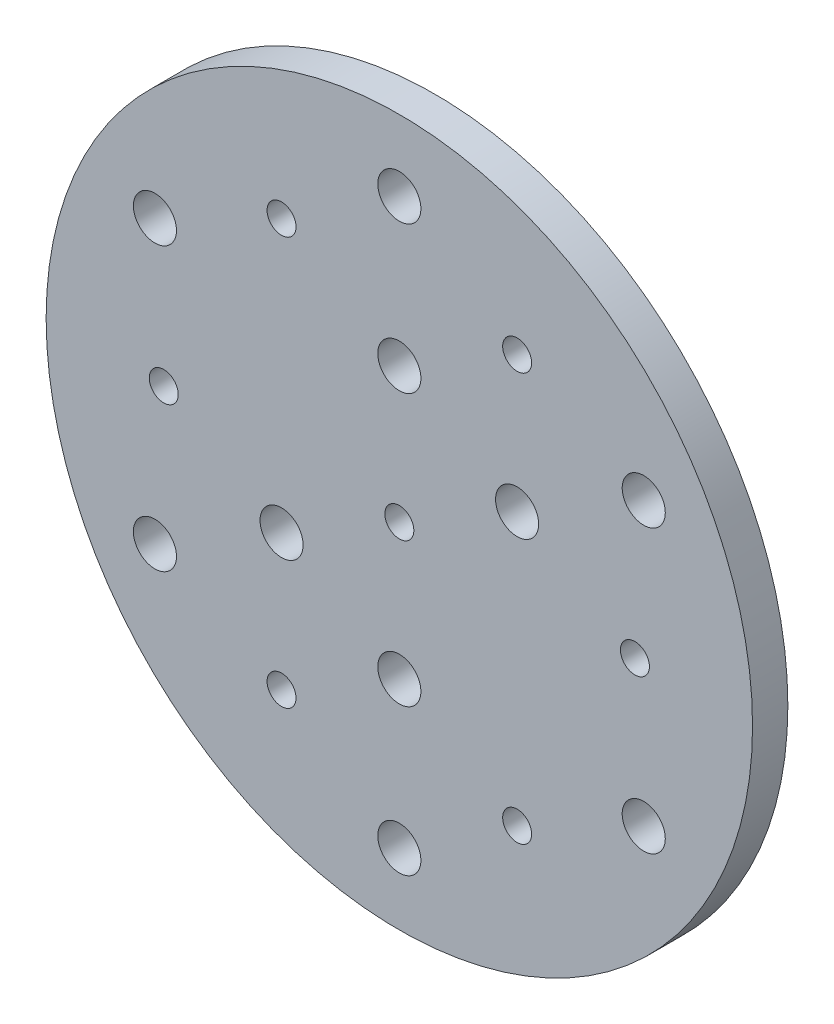
ISO-10303-21;
HEADER;
FILE_DESCRIPTION(('STEP AP214'),'2;1');
FILE_NAME('part.step','',(''),(''),'','','');
FILE_SCHEMA(('AUTOMOTIVE_DESIGN { 1 0 10303 214 1 1 1 1 }'));
ENDSEC;
DATA;
#1=APPLICATION_CONTEXT('core data for automotive mechanical design processes');
#2=APPLICATION_PROTOCOL_DEFINITION('international standard','automotive_design',2000,#1);
#3=PRODUCT_CONTEXT('',#1,'mechanical');
#4=PRODUCT('Part','Part','',(#3));
#5=PRODUCT_RELATED_PRODUCT_CATEGORY('part','',(#4));
#6=PRODUCT_DEFINITION_FORMATION('','',#4);
#7=PRODUCT_DEFINITION_CONTEXT('part definition',#1,'design');
#8=PRODUCT_DEFINITION('design','',#6,#7);
#9=PRODUCT_DEFINITION_SHAPE('','',#8);
#10=(LENGTH_UNIT() NAMED_UNIT(*) SI_UNIT(.MILLI.,.METRE.));
#11=(NAMED_UNIT(*) PLANE_ANGLE_UNIT() SI_UNIT($,.RADIAN.));
#12=(NAMED_UNIT(*) SI_UNIT($,.STERADIAN.) SOLID_ANGLE_UNIT());
#13=UNCERTAINTY_MEASURE_WITH_UNIT(LENGTH_MEASURE(1.E-05),#10,'distance_accuracy_value','');
#14=(GEOMETRIC_REPRESENTATION_CONTEXT(3) GLOBAL_UNCERTAINTY_ASSIGNED_CONTEXT((#13)) GLOBAL_UNIT_ASSIGNED_CONTEXT((#10,
#11,#12)) REPRESENTATION_CONTEXT('',''));
#15=CARTESIAN_POINT('',(0.,0.,0.));
#16=DIRECTION('',(0.,0.,1.));
#17=DIRECTION('',(1.,0.,0.));
#18=AXIS2_PLACEMENT_3D('',#15,#16,#17);
#19=CARTESIAN_POINT('',(0.,0.,5.));
#20=DIRECTION('',(0.,0.,1.));
#21=DIRECTION('',(1.,0.,0.));
#22=AXIS2_PLACEMENT_3D('',#19,#20,#21);
#23=PLANE('',#22);
#24=CARTESIAN_POINT('',(-16.671397032512,-9.62523556448782,5.));
#25=DIRECTION('',(0.,0.,1.));
#26=DIRECTION('',(1.,0.,0.));
#27=AXIS2_PLACEMENT_3D('',#24,#25,#26);
#28=CIRCLE('',#27,3.05);
#29=CARTESIAN_POINT('',(-13.621397032512,-9.62523556448782,5.));
#30=VERTEX_POINT('',#29);
#31=EDGE_CURVE('E131',#30,#30,#28,.T.);
#32=ORIENTED_EDGE('',*,*,#31,.F.);
#33=EDGE_LOOP('',(#32));
#34=FACE_BOUND('',#33,.T.);
#35=CARTESIAN_POINT('',(16.6749999999995,-28.8819472162113,5.));
#36=DIRECTION('',(0.,0.,1.));
#37=DIRECTION('',(1.,0.,0.));
#38=AXIS2_PLACEMENT_3D('',#35,#36,#37);
#39=CIRCLE('',#38,2.04999999999999);
#40=CARTESIAN_POINT('',(18.7249999999995,-28.8819472162113,5.));
#41=VERTEX_POINT('',#40);
#42=EDGE_CURVE('E119',#41,#41,#39,.T.);
#43=ORIENTED_EDGE('',*,*,#42,.F.);
#44=EDGE_LOOP('',(#43));
#45=FACE_BOUND('',#44,.T.);
#46=CARTESIAN_POINT('',(16.6750000000003,28.8819472162108,5.));
#47=DIRECTION('',(0.,0.,1.));
#48=DIRECTION('',(1.,0.,0.));
#49=AXIS2_PLACEMENT_3D('',#46,#47,#48);
#50=CIRCLE('',#49,2.04999999999999);
#51=CARTESIAN_POINT('',(18.7250000000003,28.8819472162108,5.));
#52=VERTEX_POINT('',#51);
#53=EDGE_CURVE('E107',#52,#52,#50,.T.);
#54=ORIENTED_EDGE('',*,*,#53,.F.);
#55=EDGE_LOOP('',(#54));
#56=FACE_BOUND('',#55,.T.);
#57=CARTESIAN_POINT('',(-33.35,2.35370913809432E-13,5.));
#58=DIRECTION('',(0.,0.,1.));
#59=DIRECTION('',(1.,0.,0.));
#60=AXIS2_PLACEMENT_3D('',#57,#58,#59);
#61=CIRCLE('',#60,2.04999999999999);
#62=CARTESIAN_POINT('',(-31.3,2.35370913809432E-13,5.));
#63=VERTEX_POINT('',#62);
#64=EDGE_CURVE('E95',#63,#63,#61,.T.);
#65=ORIENTED_EDGE('',*,*,#64,.F.);
#66=EDGE_LOOP('',(#65));
#67=FACE_BOUND('',#66,.T.);
#68=CARTESIAN_POINT('',(0.,-19.2327576355968,5.));
#69=DIRECTION('',(0.,0.,1.));
#70=DIRECTION('',(1.,0.,0.));
#71=AXIS2_PLACEMENT_3D('',#68,#69,#70);
#72=CIRCLE('',#71,3.05);
#73=CARTESIAN_POINT('',(3.05,-19.2327576355968,5.));
#74=VERTEX_POINT('',#73);
#75=EDGE_CURVE('E83',#74,#74,#72,.T.);
#76=ORIENTED_EDGE('',*,*,#75,.F.);
#77=EDGE_LOOP('',(#76));
#78=FACE_BOUND('',#77,.T.);
#79=CARTESIAN_POINT('',(-34.597845014494,-19.9750751325,5.));
#80=DIRECTION('',(0.,0.,1.));
#81=DIRECTION('',(1.,0.,0.));
#82=AXIS2_PLACEMENT_3D('',#79,#80,#81);
#83=CIRCLE('',#82,3.04999999999995);
#84=CARTESIAN_POINT('',(-31.547845014494,-19.9750751325,5.));
#85=VERTEX_POINT('',#84);
#86=EDGE_CURVE('E71',#85,#85,#83,.T.);
#87=ORIENTED_EDGE('',*,*,#86,.F.);
#88=EDGE_LOOP('',(#87));
#89=FACE_BOUND('',#88,.T.);
#90=CARTESIAN_POINT('',(34.5978450144957,19.9750751325029,5.));
#91=DIRECTION('',(0.,0.,1.));
#92=DIRECTION('',(1.,0.,0.));
#93=AXIS2_PLACEMENT_3D('',#90,#91,#92);
#94=CIRCLE('',#93,3.05000000000321);
#95=CARTESIAN_POINT('',(37.6478450144989,19.9750751325029,5.));
#96=VERTEX_POINT('',#95);
#97=EDGE_CURVE('E59',#96,#96,#94,.T.);
#98=ORIENTED_EDGE('',*,*,#97,.F.);
#99=EDGE_LOOP('',(#98));
#100=FACE_BOUND('',#99,.T.);
#101=CARTESIAN_POINT('',(34.5978450144973,-19.9750751324971,5.));
#102=DIRECTION('',(0.,0.,1.));
#103=DIRECTION('',(1.,0.,0.));
#104=AXIS2_PLACEMENT_3D('',#101,#102,#103);
#105=CIRCLE('',#104,3.05000000000264);
#106=CARTESIAN_POINT('',(37.6478450144999,-19.9750751324971,5.));
#107=VERTEX_POINT('',#106);
#108=EDGE_CURVE('E47',#107,#107,#105,.T.);
#109=ORIENTED_EDGE('',*,*,#108,.F.);
#110=EDGE_LOOP('',(#109));
#111=FACE_BOUND('',#110,.T.);
#112=CARTESIAN_POINT('',(0.,0.,5.));
#113=DIRECTION('',(0.,0.,1.));
#114=DIRECTION('',(1.,0.,0.));
#115=AXIS2_PLACEMENT_3D('',#112,#113,#114);
#116=CIRCLE('',#115,50.);
#117=CARTESIAN_POINT('',(50.,0.,5.));
#118=VERTEX_POINT('',#117);
#119=EDGE_CURVE('E10',#118,#118,#116,.T.);
#120=ORIENTED_EDGE('',*,*,#119,.T.);
#121=EDGE_LOOP('',(#120));
#122=FACE_BOUND('',#121,.T.);
#123=CARTESIAN_POINT('',(-34.5978450144956,19.9750751325,5.));
#124=DIRECTION('',(0.,0.,1.));
#125=DIRECTION('',(1.,0.,0.));
#126=AXIS2_PLACEMENT_3D('',#123,#124,#125);
#127=CIRCLE('',#126,3.05);
#128=CARTESIAN_POINT('',(-31.5478450144956,19.9750751325,5.));
#129=VERTEX_POINT('',#128);
#130=EDGE_CURVE('E42',#129,#129,#127,.T.);
#131=ORIENTED_EDGE('',*,*,#130,.F.);
#132=EDGE_LOOP('',(#131));
#133=FACE_BOUND('',#132,.T.);
#134=CARTESIAN_POINT('',(-1.88390969491081E-12,39.9501502650015,5.));
#135=DIRECTION('',(0.,0.,1.));
#136=DIRECTION('',(1.,0.,0.));
#137=AXIS2_PLACEMENT_3D('',#134,#135,#136);
#138=CIRCLE('',#137,3.05000000000294);
#139=CARTESIAN_POINT('',(3.05000000000106,39.9501502650015,5.));
#140=VERTEX_POINT('',#139);
#141=EDGE_CURVE('E53',#140,#140,#138,.T.);
#142=ORIENTED_EDGE('',*,*,#141,.F.);
#143=EDGE_LOOP('',(#142));
#144=FACE_BOUND('',#143,.T.);
#145=CARTESIAN_POINT('',(2.50747571869056E-12,-39.9501502649986,5.));
#146=DIRECTION('',(0.,0.,1.));
#147=DIRECTION('',(1.,0.,0.));
#148=AXIS2_PLACEMENT_3D('',#145,#146,#147);
#149=CIRCLE('',#148,3.05000000000111);
#150=CARTESIAN_POINT('',(3.05000000000361,-39.9501502649986,5.));
#151=VERTEX_POINT('',#150);
#152=EDGE_CURVE('E65',#151,#151,#149,.T.);
#153=ORIENTED_EDGE('',*,*,#152,.F.);
#154=EDGE_LOOP('',(#153));
#155=FACE_BOUND('',#154,.T.);
#156=CARTESIAN_POINT('',(0.,19.165334425404,5.));
#157=DIRECTION('',(0.,0.,1.));
#158=DIRECTION('',(1.,0.,0.));
#159=AXIS2_PLACEMENT_3D('',#156,#157,#158);
#160=CIRCLE('',#159,3.05);
#161=CARTESIAN_POINT('',(3.05,19.165334425404,5.));
#162=VERTEX_POINT('',#161);
#163=EDGE_CURVE('E77',#162,#162,#160,.T.);
#164=ORIENTED_EDGE('',*,*,#163,.F.);
#165=EDGE_LOOP('',(#164));
#166=FACE_BOUND('',#165,.T.);
#167=CARTESIAN_POINT('',(0.,0.,5.));
#168=DIRECTION('',(0.,0.,1.));
#169=DIRECTION('',(1.,0.,0.));
#170=AXIS2_PLACEMENT_3D('',#167,#168,#169);
#171=CIRCLE('',#170,2.05);
#172=CARTESIAN_POINT('',(2.05,0.,5.));
#173=VERTEX_POINT('',#172);
#174=EDGE_CURVE('E89',#173,#173,#171,.T.);
#175=ORIENTED_EDGE('',*,*,#174,.F.);
#176=EDGE_LOOP('',(#175));
#177=FACE_BOUND('',#176,.T.);
#178=CARTESIAN_POINT('',(-16.6749999999997,28.8819472162112,5.));
#179=DIRECTION('',(0.,0.,1.));
#180=DIRECTION('',(1.,0.,0.));
#181=AXIS2_PLACEMENT_3D('',#178,#179,#180);
#182=CIRCLE('',#181,2.04999999999999);
#183=CARTESIAN_POINT('',(-14.6249999999997,28.8819472162112,5.));
#184=VERTEX_POINT('',#183);
#185=EDGE_CURVE('E101',#184,#184,#182,.T.);
#186=ORIENTED_EDGE('',*,*,#185,.F.);
#187=EDGE_LOOP('',(#186));
#188=FACE_BOUND('',#187,.T.);
#189=CARTESIAN_POINT('',(33.35,-4.68252719110269E-13,5.));
#190=DIRECTION('',(0.,0.,1.));
#191=DIRECTION('',(1.,0.,0.));
#192=AXIS2_PLACEMENT_3D('',#189,#190,#191);
#193=CIRCLE('',#192,2.05);
#194=CARTESIAN_POINT('',(35.4,-4.68252719110269E-13,5.));
#195=VERTEX_POINT('',#194);
#196=EDGE_CURVE('E113',#195,#195,#193,.T.);
#197=ORIENTED_EDGE('',*,*,#196,.F.);
#198=EDGE_LOOP('',(#197));
#199=FACE_BOUND('',#198,.T.);
#200=CARTESIAN_POINT('',(-16.6750000000005,-28.8819472162107,5.));
#201=DIRECTION('',(0.,0.,1.));
#202=DIRECTION('',(1.,0.,0.));
#203=AXIS2_PLACEMENT_3D('',#200,#201,#202);
#204=CIRCLE('',#203,2.04999999999999);
#205=CARTESIAN_POINT('',(-14.6250000000005,-28.8819472162107,5.));
#206=VERTEX_POINT('',#205);
#207=EDGE_CURVE('E125',#206,#206,#204,.T.);
#208=ORIENTED_EDGE('',*,*,#207,.F.);
#209=EDGE_LOOP('',(#208));
#210=FACE_BOUND('',#209,.T.);
#211=CARTESIAN_POINT('',(16.6695717959106,9.62418176364465,5.));
#212=DIRECTION('',(0.,0.,1.));
#213=DIRECTION('',(1.,0.,0.));
#214=AXIS2_PLACEMENT_3D('',#211,#212,#213);
#215=CIRCLE('',#214,3.05);
#216=CARTESIAN_POINT('',(19.7195717959106,9.62418176364465,5.));
#217=VERTEX_POINT('',#216);
#218=EDGE_CURVE('E137',#217,#217,#215,.T.);
#219=ORIENTED_EDGE('',*,*,#218,.F.);
#220=EDGE_LOOP('',(#219));
#221=FACE_BOUND('',#220,.T.);
#222=ADVANCED_FACE('F31',(#34,#45,#56,#67,#78,#89,#100,#111,#122,#133,#144,#155,#166,#177,#188,
#199,#210,#221),#23,.T.);
#223=CARTESIAN_POINT('',(0.,0.,0.));
#224=DIRECTION('',(0.,0.,1.));
#225=DIRECTION('',(1.,0.,0.));
#226=AXIS2_PLACEMENT_3D('',#223,#224,#225);
#227=PLANE('',#226);
#228=CARTESIAN_POINT('',(0.,0.,0.));
#229=DIRECTION('',(0.,0.,1.));
#230=DIRECTION('',(1.,0.,0.));
#231=AXIS2_PLACEMENT_3D('',#228,#229,#230);
#232=CIRCLE('',#231,50.);
#233=CARTESIAN_POINT('',(50.,0.,0.));
#234=VERTEX_POINT('',#233);
#235=EDGE_CURVE('E35',#234,#234,#232,.T.);
#236=ORIENTED_EDGE('',*,*,#235,.F.);
#237=EDGE_LOOP('',(#236));
#238=FACE_BOUND('',#237,.T.);
#239=CARTESIAN_POINT('',(-34.5978450144956,19.9750751325,0.));
#240=DIRECTION('',(0.,0.,1.));
#241=DIRECTION('',(1.,0.,0.));
#242=AXIS2_PLACEMENT_3D('',#239,#240,#241);
#243=CIRCLE('',#242,3.05);
#244=CARTESIAN_POINT('',(-31.5478450144956,19.9750751325,0.));
#245=VERTEX_POINT('',#244);
#246=EDGE_CURVE('E44',#245,#245,#243,.T.);
#247=ORIENTED_EDGE('',*,*,#246,.T.);
#248=EDGE_LOOP('',(#247));
#249=FACE_BOUND('',#248,.T.);
#250=CARTESIAN_POINT('',(34.5978450144973,-19.9750751324971,0.));
#251=DIRECTION('',(0.,0.,1.));
#252=DIRECTION('',(1.,0.,0.));
#253=AXIS2_PLACEMENT_3D('',#250,#251,#252);
#254=CIRCLE('',#253,3.05000000000264);
#255=CARTESIAN_POINT('',(37.6478450144999,-19.9750751324971,0.));
#256=VERTEX_POINT('',#255);
#257=EDGE_CURVE('E50',#256,#256,#254,.T.);
#258=ORIENTED_EDGE('',*,*,#257,.T.);
#259=EDGE_LOOP('',(#258));
#260=FACE_BOUND('',#259,.T.);
#261=CARTESIAN_POINT('',(-1.88390969491081E-12,39.9501502650015,0.));
#262=DIRECTION('',(0.,0.,1.));
#263=DIRECTION('',(1.,0.,0.));
#264=AXIS2_PLACEMENT_3D('',#261,#262,#263);
#265=CIRCLE('',#264,3.05000000000294);
#266=CARTESIAN_POINT('',(3.05000000000106,39.9501502650015,0.));
#267=VERTEX_POINT('',#266);
#268=EDGE_CURVE('E56',#267,#267,#265,.T.);
#269=ORIENTED_EDGE('',*,*,#268,.T.);
#270=EDGE_LOOP('',(#269));
#271=FACE_BOUND('',#270,.T.);
#272=CARTESIAN_POINT('',(34.5978450144957,19.9750751325029,0.));
#273=DIRECTION('',(0.,0.,1.));
#274=DIRECTION('',(1.,0.,0.));
#275=AXIS2_PLACEMENT_3D('',#272,#273,#274);
#276=CIRCLE('',#275,3.05000000000321);
#277=CARTESIAN_POINT('',(37.6478450144989,19.9750751325029,0.));
#278=VERTEX_POINT('',#277);
#279=EDGE_CURVE('E62',#278,#278,#276,.T.);
#280=ORIENTED_EDGE('',*,*,#279,.T.);
#281=EDGE_LOOP('',(#280));
#282=FACE_BOUND('',#281,.T.);
#283=CARTESIAN_POINT('',(2.50747571869056E-12,-39.9501502649986,0.));
#284=DIRECTION('',(0.,0.,1.));
#285=DIRECTION('',(1.,0.,0.));
#286=AXIS2_PLACEMENT_3D('',#283,#284,#285);
#287=CIRCLE('',#286,3.05000000000111);
#288=CARTESIAN_POINT('',(3.05000000000361,-39.9501502649986,0.));
#289=VERTEX_POINT('',#288);
#290=EDGE_CURVE('E68',#289,#289,#287,.T.);
#291=ORIENTED_EDGE('',*,*,#290,.T.);
#292=EDGE_LOOP('',(#291));
#293=FACE_BOUND('',#292,.T.);
#294=CARTESIAN_POINT('',(-34.597845014494,-19.9750751325,0.));
#295=DIRECTION('',(0.,0.,1.));
#296=DIRECTION('',(1.,0.,0.));
#297=AXIS2_PLACEMENT_3D('',#294,#295,#296);
#298=CIRCLE('',#297,3.04999999999995);
#299=CARTESIAN_POINT('',(-31.547845014494,-19.9750751325,0.));
#300=VERTEX_POINT('',#299);
#301=EDGE_CURVE('E74',#300,#300,#298,.T.);
#302=ORIENTED_EDGE('',*,*,#301,.T.);
#303=EDGE_LOOP('',(#302));
#304=FACE_BOUND('',#303,.T.);
#305=CARTESIAN_POINT('',(0.,19.165334425404,0.));
#306=DIRECTION('',(0.,0.,1.));
#307=DIRECTION('',(1.,0.,0.));
#308=AXIS2_PLACEMENT_3D('',#305,#306,#307);
#309=CIRCLE('',#308,3.05);
#310=CARTESIAN_POINT('',(3.05,19.165334425404,0.));
#311=VERTEX_POINT('',#310);
#312=EDGE_CURVE('E80',#311,#311,#309,.T.);
#313=ORIENTED_EDGE('',*,*,#312,.T.);
#314=EDGE_LOOP('',(#313));
#315=FACE_BOUND('',#314,.T.);
#316=CARTESIAN_POINT('',(0.,-19.2327576355968,0.));
#317=DIRECTION('',(0.,0.,1.));
#318=DIRECTION('',(1.,0.,0.));
#319=AXIS2_PLACEMENT_3D('',#316,#317,#318);
#320=CIRCLE('',#319,3.05);
#321=CARTESIAN_POINT('',(3.05,-19.2327576355968,0.));
#322=VERTEX_POINT('',#321);
#323=EDGE_CURVE('E86',#322,#322,#320,.T.);
#324=ORIENTED_EDGE('',*,*,#323,.T.);
#325=EDGE_LOOP('',(#324));
#326=FACE_BOUND('',#325,.T.);
#327=CARTESIAN_POINT('',(0.,0.,0.));
#328=DIRECTION('',(0.,0.,1.));
#329=DIRECTION('',(1.,0.,0.));
#330=AXIS2_PLACEMENT_3D('',#327,#328,#329);
#331=CIRCLE('',#330,2.05);
#332=CARTESIAN_POINT('',(2.05,0.,0.));
#333=VERTEX_POINT('',#332);
#334=EDGE_CURVE('E92',#333,#333,#331,.T.);
#335=ORIENTED_EDGE('',*,*,#334,.T.);
#336=EDGE_LOOP('',(#335));
#337=FACE_BOUND('',#336,.T.);
#338=CARTESIAN_POINT('',(-33.35,2.35370913809432E-13,0.));
#339=DIRECTION('',(0.,0.,1.));
#340=DIRECTION('',(1.,0.,0.));
#341=AXIS2_PLACEMENT_3D('',#338,#339,#340);
#342=CIRCLE('',#341,2.04999999999999);
#343=CARTESIAN_POINT('',(-31.3,2.35370913809432E-13,0.));
#344=VERTEX_POINT('',#343);
#345=EDGE_CURVE('E98',#344,#344,#342,.T.);
#346=ORIENTED_EDGE('',*,*,#345,.T.);
#347=EDGE_LOOP('',(#346));
#348=FACE_BOUND('',#347,.T.);
#349=CARTESIAN_POINT('',(-16.6749999999997,28.8819472162112,0.));
#350=DIRECTION('',(0.,0.,1.));
#351=DIRECTION('',(1.,0.,0.));
#352=AXIS2_PLACEMENT_3D('',#349,#350,#351);
#353=CIRCLE('',#352,2.04999999999999);
#354=CARTESIAN_POINT('',(-14.6249999999997,28.8819472162112,0.));
#355=VERTEX_POINT('',#354);
#356=EDGE_CURVE('E104',#355,#355,#353,.T.);
#357=ORIENTED_EDGE('',*,*,#356,.T.);
#358=EDGE_LOOP('',(#357));
#359=FACE_BOUND('',#358,.T.);
#360=CARTESIAN_POINT('',(16.6750000000003,28.8819472162108,0.));
#361=DIRECTION('',(0.,0.,1.));
#362=DIRECTION('',(1.,0.,0.));
#363=AXIS2_PLACEMENT_3D('',#360,#361,#362);
#364=CIRCLE('',#363,2.04999999999999);
#365=CARTESIAN_POINT('',(18.7250000000003,28.8819472162108,0.));
#366=VERTEX_POINT('',#365);
#367=EDGE_CURVE('E110',#366,#366,#364,.T.);
#368=ORIENTED_EDGE('',*,*,#367,.T.);
#369=EDGE_LOOP('',(#368));
#370=FACE_BOUND('',#369,.T.);
#371=CARTESIAN_POINT('',(33.35,-4.68252719110269E-13,0.));
#372=DIRECTION('',(0.,0.,1.));
#373=DIRECTION('',(1.,0.,0.));
#374=AXIS2_PLACEMENT_3D('',#371,#372,#373);
#375=CIRCLE('',#374,2.05);
#376=CARTESIAN_POINT('',(35.4,-4.68252719110269E-13,0.));
#377=VERTEX_POINT('',#376);
#378=EDGE_CURVE('E116',#377,#377,#375,.T.);
#379=ORIENTED_EDGE('',*,*,#378,.T.);
#380=EDGE_LOOP('',(#379));
#381=FACE_BOUND('',#380,.T.);
#382=CARTESIAN_POINT('',(16.6749999999995,-28.8819472162113,0.));
#383=DIRECTION('',(0.,0.,1.));
#384=DIRECTION('',(1.,0.,0.));
#385=AXIS2_PLACEMENT_3D('',#382,#383,#384);
#386=CIRCLE('',#385,2.04999999999999);
#387=CARTESIAN_POINT('',(18.7249999999995,-28.8819472162113,0.));
#388=VERTEX_POINT('',#387);
#389=EDGE_CURVE('E122',#388,#388,#386,.T.);
#390=ORIENTED_EDGE('',*,*,#389,.T.);
#391=EDGE_LOOP('',(#390));
#392=FACE_BOUND('',#391,.T.);
#393=CARTESIAN_POINT('',(-16.6750000000005,-28.8819472162107,0.));
#394=DIRECTION('',(0.,0.,1.));
#395=DIRECTION('',(1.,0.,0.));
#396=AXIS2_PLACEMENT_3D('',#393,#394,#395);
#397=CIRCLE('',#396,2.04999999999999);
#398=CARTESIAN_POINT('',(-14.6250000000005,-28.8819472162107,0.));
#399=VERTEX_POINT('',#398);
#400=EDGE_CURVE('E128',#399,#399,#397,.T.);
#401=ORIENTED_EDGE('',*,*,#400,.T.);
#402=EDGE_LOOP('',(#401));
#403=FACE_BOUND('',#402,.T.);
#404=CARTESIAN_POINT('',(-16.671397032512,-9.62523556448782,0.));
#405=DIRECTION('',(0.,0.,1.));
#406=DIRECTION('',(1.,0.,0.));
#407=AXIS2_PLACEMENT_3D('',#404,#405,#406);
#408=CIRCLE('',#407,3.05);
#409=CARTESIAN_POINT('',(-13.621397032512,-9.62523556448782,0.));
#410=VERTEX_POINT('',#409);
#411=EDGE_CURVE('E134',#410,#410,#408,.T.);
#412=ORIENTED_EDGE('',*,*,#411,.T.);
#413=EDGE_LOOP('',(#412));
#414=FACE_BOUND('',#413,.T.);
#415=CARTESIAN_POINT('',(16.6695717959106,9.62418176364465,0.));
#416=DIRECTION('',(0.,0.,1.));
#417=DIRECTION('',(1.,0.,0.));
#418=AXIS2_PLACEMENT_3D('',#415,#416,#417);
#419=CIRCLE('',#418,3.05);
#420=CARTESIAN_POINT('',(19.7195717959106,9.62418176364465,0.));
#421=VERTEX_POINT('',#420);
#422=EDGE_CURVE('E140',#421,#421,#419,.T.);
#423=ORIENTED_EDGE('',*,*,#422,.T.);
#424=EDGE_LOOP('',(#423));
#425=FACE_BOUND('',#424,.T.);
#426=ADVANCED_FACE('F150',(#238,#249,#260,#271,#282,#293,#304,#315,#326,#337,#348,#359,#370,
#381,#392,#403,#414,#425),#227,.F.);
#427=CARTESIAN_POINT('',(0.,0.,5.));
#428=DIRECTION('',(0.,0.,-1.));
#429=DIRECTION('',(-1.,0.,0.));
#430=AXIS2_PLACEMENT_3D('',#427,#428,#429);
#431=CYLINDRICAL_SURFACE('',#430,50.);
#432=ORIENTED_EDGE('',*,*,#119,.F.);
#433=EDGE_LOOP('',(#432));
#434=FACE_BOUND('',#433,.T.);
#435=ORIENTED_EDGE('',*,*,#235,.T.);
#436=EDGE_LOOP('',(#435));
#437=FACE_BOUND('',#436,.T.);
#438=ADVANCED_FACE('F33',(#434,#437),#431,.T.);
#439=CARTESIAN_POINT('',(-34.5978450144956,19.9750751325,5.));
#440=DIRECTION('',(0.,0.,-1.));
#441=DIRECTION('',(-1.,0.,0.));
#442=AXIS2_PLACEMENT_3D('',#439,#440,#441);
#443=CYLINDRICAL_SURFACE('',#442,3.05);
#444=ORIENTED_EDGE('',*,*,#130,.T.);
#445=EDGE_LOOP('',(#444));
#446=FACE_BOUND('',#445,.T.);
#447=ORIENTED_EDGE('',*,*,#246,.F.);
#448=EDGE_LOOP('',(#447));
#449=FACE_BOUND('',#448,.T.);
#450=ADVANCED_FACE('F160',(#446,#449),#443,.F.);
#451=CARTESIAN_POINT('',(34.5978450144973,-19.9750751324971,5.));
#452=DIRECTION('',(0.,0.,-1.));
#453=DIRECTION('',(-1.,0.,0.));
#454=AXIS2_PLACEMENT_3D('',#451,#452,#453);
#455=CYLINDRICAL_SURFACE('',#454,3.05000000000264);
#456=ORIENTED_EDGE('',*,*,#108,.T.);
#457=EDGE_LOOP('',(#456));
#458=FACE_BOUND('',#457,.T.);
#459=ORIENTED_EDGE('',*,*,#257,.F.);
#460=EDGE_LOOP('',(#459));
#461=FACE_BOUND('',#460,.T.);
#462=ADVANCED_FACE('F163',(#458,#461),#455,.F.);
#463=CARTESIAN_POINT('',(-1.88390969491081E-12,39.9501502650015,5.));
#464=DIRECTION('',(0.,0.,-1.));
#465=DIRECTION('',(-1.,0.,0.));
#466=AXIS2_PLACEMENT_3D('',#463,#464,#465);
#467=CYLINDRICAL_SURFACE('',#466,3.05000000000294);
#468=ORIENTED_EDGE('',*,*,#141,.T.);
#469=EDGE_LOOP('',(#468));
#470=FACE_BOUND('',#469,.T.);
#471=ORIENTED_EDGE('',*,*,#268,.F.);
#472=EDGE_LOOP('',(#471));
#473=FACE_BOUND('',#472,.T.);
#474=ADVANCED_FACE('F167',(#470,#473),#467,.F.);
#475=CARTESIAN_POINT('',(34.5978450144957,19.9750751325029,5.));
#476=DIRECTION('',(0.,0.,-1.));
#477=DIRECTION('',(-1.,0.,0.));
#478=AXIS2_PLACEMENT_3D('',#475,#476,#477);
#479=CYLINDRICAL_SURFACE('',#478,3.05000000000321);
#480=ORIENTED_EDGE('',*,*,#97,.T.);
#481=EDGE_LOOP('',(#480));
#482=FACE_BOUND('',#481,.T.);
#483=ORIENTED_EDGE('',*,*,#279,.F.);
#484=EDGE_LOOP('',(#483));
#485=FACE_BOUND('',#484,.T.);
#486=ADVANCED_FACE('F171',(#482,#485),#479,.F.);
#487=CARTESIAN_POINT('',(2.50747571869056E-12,-39.9501502649986,5.));
#488=DIRECTION('',(0.,0.,-1.));
#489=DIRECTION('',(-1.,0.,0.));
#490=AXIS2_PLACEMENT_3D('',#487,#488,#489);
#491=CYLINDRICAL_SURFACE('',#490,3.05000000000111);
#492=ORIENTED_EDGE('',*,*,#152,.T.);
#493=EDGE_LOOP('',(#492));
#494=FACE_BOUND('',#493,.T.);
#495=ORIENTED_EDGE('',*,*,#290,.F.);
#496=EDGE_LOOP('',(#495));
#497=FACE_BOUND('',#496,.T.);
#498=ADVANCED_FACE('F175',(#494,#497),#491,.F.);
#499=CARTESIAN_POINT('',(-34.597845014494,-19.9750751325,5.));
#500=DIRECTION('',(0.,0.,-1.));
#501=DIRECTION('',(-1.,0.,0.));
#502=AXIS2_PLACEMENT_3D('',#499,#500,#501);
#503=CYLINDRICAL_SURFACE('',#502,3.04999999999995);
#504=ORIENTED_EDGE('',*,*,#86,.T.);
#505=EDGE_LOOP('',(#504));
#506=FACE_BOUND('',#505,.T.);
#507=ORIENTED_EDGE('',*,*,#301,.F.);
#508=EDGE_LOOP('',(#507));
#509=FACE_BOUND('',#508,.T.);
#510=ADVANCED_FACE('F179',(#506,#509),#503,.F.);
#511=CARTESIAN_POINT('',(0.,19.165334425404,5.));
#512=DIRECTION('',(0.,0.,-1.));
#513=DIRECTION('',(-1.,0.,0.));
#514=AXIS2_PLACEMENT_3D('',#511,#512,#513);
#515=CYLINDRICAL_SURFACE('',#514,3.05);
#516=ORIENTED_EDGE('',*,*,#163,.T.);
#517=EDGE_LOOP('',(#516));
#518=FACE_BOUND('',#517,.T.);
#519=ORIENTED_EDGE('',*,*,#312,.F.);
#520=EDGE_LOOP('',(#519));
#521=FACE_BOUND('',#520,.T.);
#522=ADVANCED_FACE('F183',(#518,#521),#515,.F.);
#523=CARTESIAN_POINT('',(0.,-19.2327576355968,5.));
#524=DIRECTION('',(0.,0.,-1.));
#525=DIRECTION('',(-1.,0.,0.));
#526=AXIS2_PLACEMENT_3D('',#523,#524,#525);
#527=CYLINDRICAL_SURFACE('',#526,3.05);
#528=ORIENTED_EDGE('',*,*,#75,.T.);
#529=EDGE_LOOP('',(#528));
#530=FACE_BOUND('',#529,.T.);
#531=ORIENTED_EDGE('',*,*,#323,.F.);
#532=EDGE_LOOP('',(#531));
#533=FACE_BOUND('',#532,.T.);
#534=ADVANCED_FACE('F187',(#530,#533),#527,.F.);
#535=CARTESIAN_POINT('',(0.,0.,5.));
#536=DIRECTION('',(0.,0.,-1.));
#537=DIRECTION('',(-1.,0.,0.));
#538=AXIS2_PLACEMENT_3D('',#535,#536,#537);
#539=CYLINDRICAL_SURFACE('',#538,2.05);
#540=ORIENTED_EDGE('',*,*,#174,.T.);
#541=EDGE_LOOP('',(#540));
#542=FACE_BOUND('',#541,.T.);
#543=ORIENTED_EDGE('',*,*,#334,.F.);
#544=EDGE_LOOP('',(#543));
#545=FACE_BOUND('',#544,.T.);
#546=ADVANCED_FACE('F191',(#542,#545),#539,.F.);
#547=CARTESIAN_POINT('',(-33.35,2.35370913809432E-13,5.));
#548=DIRECTION('',(0.,0.,-1.));
#549=DIRECTION('',(-1.,0.,0.));
#550=AXIS2_PLACEMENT_3D('',#547,#548,#549);
#551=CYLINDRICAL_SURFACE('',#550,2.04999999999999);
#552=ORIENTED_EDGE('',*,*,#64,.T.);
#553=EDGE_LOOP('',(#552));
#554=FACE_BOUND('',#553,.T.);
#555=ORIENTED_EDGE('',*,*,#345,.F.);
#556=EDGE_LOOP('',(#555));
#557=FACE_BOUND('',#556,.T.);
#558=ADVANCED_FACE('F195',(#554,#557),#551,.F.);
#559=CARTESIAN_POINT('',(-16.6749999999997,28.8819472162112,5.));
#560=DIRECTION('',(0.,0.,-1.));
#561=DIRECTION('',(-1.,0.,0.));
#562=AXIS2_PLACEMENT_3D('',#559,#560,#561);
#563=CYLINDRICAL_SURFACE('',#562,2.04999999999999);
#564=ORIENTED_EDGE('',*,*,#185,.T.);
#565=EDGE_LOOP('',(#564));
#566=FACE_BOUND('',#565,.T.);
#567=ORIENTED_EDGE('',*,*,#356,.F.);
#568=EDGE_LOOP('',(#567));
#569=FACE_BOUND('',#568,.T.);
#570=ADVANCED_FACE('F199',(#566,#569),#563,.F.);
#571=CARTESIAN_POINT('',(16.6750000000003,28.8819472162108,5.));
#572=DIRECTION('',(0.,0.,-1.));
#573=DIRECTION('',(-1.,0.,0.));
#574=AXIS2_PLACEMENT_3D('',#571,#572,#573);
#575=CYLINDRICAL_SURFACE('',#574,2.04999999999999);
#576=ORIENTED_EDGE('',*,*,#53,.T.);
#577=EDGE_LOOP('',(#576));
#578=FACE_BOUND('',#577,.T.);
#579=ORIENTED_EDGE('',*,*,#367,.F.);
#580=EDGE_LOOP('',(#579));
#581=FACE_BOUND('',#580,.T.);
#582=ADVANCED_FACE('F203',(#578,#581),#575,.F.);
#583=CARTESIAN_POINT('',(33.35,-4.68252719110269E-13,5.));
#584=DIRECTION('',(0.,0.,-1.));
#585=DIRECTION('',(-1.,0.,0.));
#586=AXIS2_PLACEMENT_3D('',#583,#584,#585);
#587=CYLINDRICAL_SURFACE('',#586,2.05);
#588=ORIENTED_EDGE('',*,*,#196,.T.);
#589=EDGE_LOOP('',(#588));
#590=FACE_BOUND('',#589,.T.);
#591=ORIENTED_EDGE('',*,*,#378,.F.);
#592=EDGE_LOOP('',(#591));
#593=FACE_BOUND('',#592,.T.);
#594=ADVANCED_FACE('F207',(#590,#593),#587,.F.);
#595=CARTESIAN_POINT('',(16.6749999999995,-28.8819472162113,5.));
#596=DIRECTION('',(0.,0.,-1.));
#597=DIRECTION('',(-1.,0.,0.));
#598=AXIS2_PLACEMENT_3D('',#595,#596,#597);
#599=CYLINDRICAL_SURFACE('',#598,2.04999999999999);
#600=ORIENTED_EDGE('',*,*,#42,.T.);
#601=EDGE_LOOP('',(#600));
#602=FACE_BOUND('',#601,.T.);
#603=ORIENTED_EDGE('',*,*,#389,.F.);
#604=EDGE_LOOP('',(#603));
#605=FACE_BOUND('',#604,.T.);
#606=ADVANCED_FACE('F211',(#602,#605),#599,.F.);
#607=CARTESIAN_POINT('',(-16.6750000000005,-28.8819472162107,5.));
#608=DIRECTION('',(0.,0.,-1.));
#609=DIRECTION('',(-1.,0.,0.));
#610=AXIS2_PLACEMENT_3D('',#607,#608,#609);
#611=CYLINDRICAL_SURFACE('',#610,2.04999999999999);
#612=ORIENTED_EDGE('',*,*,#207,.T.);
#613=EDGE_LOOP('',(#612));
#614=FACE_BOUND('',#613,.T.);
#615=ORIENTED_EDGE('',*,*,#400,.F.);
#616=EDGE_LOOP('',(#615));
#617=FACE_BOUND('',#616,.T.);
#618=ADVANCED_FACE('F215',(#614,#617),#611,.F.);
#619=CARTESIAN_POINT('',(-16.671397032512,-9.62523556448782,5.));
#620=DIRECTION('',(0.,0.,-1.));
#621=DIRECTION('',(-1.,0.,0.));
#622=AXIS2_PLACEMENT_3D('',#619,#620,#621);
#623=CYLINDRICAL_SURFACE('',#622,3.05);
#624=ORIENTED_EDGE('',*,*,#31,.T.);
#625=EDGE_LOOP('',(#624));
#626=FACE_BOUND('',#625,.T.);
#627=ORIENTED_EDGE('',*,*,#411,.F.);
#628=EDGE_LOOP('',(#627));
#629=FACE_BOUND('',#628,.T.);
#630=ADVANCED_FACE('F219',(#626,#629),#623,.F.);
#631=CARTESIAN_POINT('',(16.6695717959106,9.62418176364465,5.));
#632=DIRECTION('',(0.,0.,-1.));
#633=DIRECTION('',(-1.,0.,0.));
#634=AXIS2_PLACEMENT_3D('',#631,#632,#633);
#635=CYLINDRICAL_SURFACE('',#634,3.05);
#636=ORIENTED_EDGE('',*,*,#218,.T.);
#637=EDGE_LOOP('',(#636));
#638=FACE_BOUND('',#637,.T.);
#639=ORIENTED_EDGE('',*,*,#422,.F.);
#640=EDGE_LOOP('',(#639));
#641=FACE_BOUND('',#640,.T.);
#642=ADVANCED_FACE('F146',(#638,#641),#635,.F.);
#643=CLOSED_SHELL('',(#222,#426,#438,#450,#462,#474,#486,#498,#510,#522,#534,#546,#558,#570,
#582,#594,#606,#618,#630,#642));
#644=MANIFOLD_SOLID_BREP('B2',#643);
#645=ADVANCED_BREP_SHAPE_REPRESENTATION('',(#18,#644),#14);
#646=SHAPE_DEFINITION_REPRESENTATION(#9,#645);
ENDSEC;
END-ISO-10303-21;
